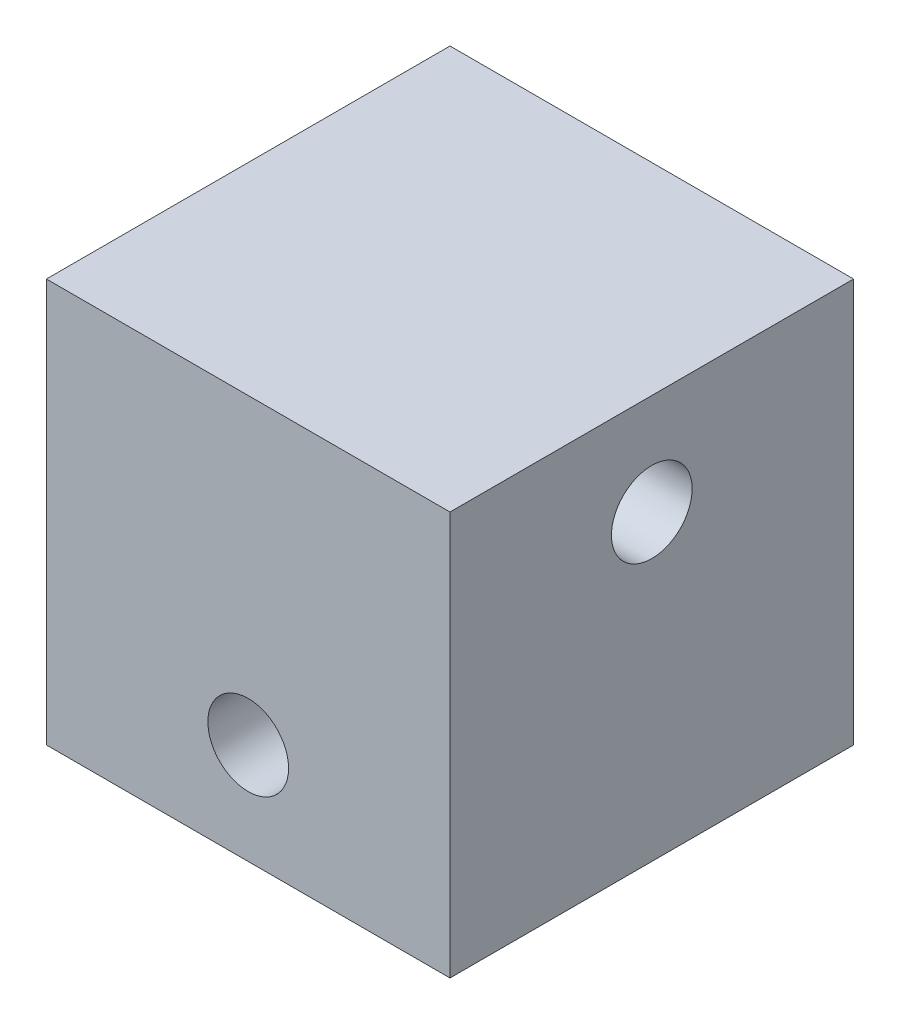
ISO-10303-21;
HEADER;
FILE_DESCRIPTION(('STEP AP214'),'2;1');
FILE_NAME('part.step','',(''),(''),'','','');
FILE_SCHEMA(('AUTOMOTIVE_DESIGN { 1 0 10303 214 1 1 1 1 }'));
ENDSEC;
DATA;
#1=APPLICATION_CONTEXT('core data for automotive mechanical design processes');
#2=APPLICATION_PROTOCOL_DEFINITION('international standard','automotive_design',2000,#1);
#3=PRODUCT_CONTEXT('',#1,'mechanical');
#4=PRODUCT('Part','Part','',(#3));
#5=PRODUCT_RELATED_PRODUCT_CATEGORY('part','',(#4));
#6=PRODUCT_DEFINITION_FORMATION('','',#4);
#7=PRODUCT_DEFINITION_CONTEXT('part definition',#1,'design');
#8=PRODUCT_DEFINITION('design','',#6,#7);
#9=PRODUCT_DEFINITION_SHAPE('','',#8);
#10=(LENGTH_UNIT() NAMED_UNIT(*) SI_UNIT(.MILLI.,.METRE.));
#11=(NAMED_UNIT(*) PLANE_ANGLE_UNIT() SI_UNIT($,.RADIAN.));
#12=(NAMED_UNIT(*) SI_UNIT($,.STERADIAN.) SOLID_ANGLE_UNIT());
#13=UNCERTAINTY_MEASURE_WITH_UNIT(LENGTH_MEASURE(1.E-05),#10,'distance_accuracy_value','');
#14=(GEOMETRIC_REPRESENTATION_CONTEXT(3) GLOBAL_UNCERTAINTY_ASSIGNED_CONTEXT((#13)) GLOBAL_UNIT_ASSIGNED_CONTEXT((#10,
#11,#12)) REPRESENTATION_CONTEXT('',''));
#15=CARTESIAN_POINT('',(0.,0.,0.));
#16=DIRECTION('',(0.,0.,1.));
#17=DIRECTION('',(1.,0.,0.));
#18=AXIS2_PLACEMENT_3D('',#15,#16,#17);
#19=CARTESIAN_POINT('',(-20.,0.,0.));
#20=DIRECTION('',(1.,0.,0.));
#21=DIRECTION('',(0.,0.,-1.));
#22=AXIS2_PLACEMENT_3D('',#19,#20,#21);
#23=CYLINDRICAL_SURFACE('',#22,4.);
#24=CARTESIAN_POINT('',(-20.,0.,0.));
#25=DIRECTION('',(1.,0.,0.));
#26=DIRECTION('',(0.,0.,-1.));
#27=AXIS2_PLACEMENT_3D('',#24,#25,#26);
#28=CIRCLE('',#27,4.);
#29=CARTESIAN_POINT('',(-20.,0.,-4.));
#30=VERTEX_POINT('',#29);
#31=EDGE_CURVE('E79',#30,#30,#28,.T.);
#32=ORIENTED_EDGE('',*,*,#31,.F.);
#33=EDGE_LOOP('',(#32));
#34=FACE_BOUND('',#33,.T.);
#35=CARTESIAN_POINT('',(20.,0.,0.));
#36=DIRECTION('',(1.,0.,0.));
#37=DIRECTION('',(0.,0.,-1.));
#38=AXIS2_PLACEMENT_3D('',#35,#36,#37);
#39=CIRCLE('',#38,4.);
#40=CARTESIAN_POINT('',(20.,0.,-4.));
#41=VERTEX_POINT('',#40);
#42=EDGE_CURVE('E21',#41,#41,#39,.F.);
#43=ORIENTED_EDGE('',*,*,#42,.F.);
#44=EDGE_LOOP('',(#43));
#45=FACE_BOUND('',#44,.T.);
#46=ADVANCED_FACE('F17',(#34,#45),#23,.F.);
#47=CARTESIAN_POINT('',(-20.01,-30.,20.01));
#48=DIRECTION('',(0.,-1.,0.));
#49=DIRECTION('',(0.,0.,-1.));
#50=AXIS2_PLACEMENT_3D('',#47,#48,#49);
#51=PLANE('',#50);
#52=DIRECTION('',(1.,0.,0.));
#53=VECTOR('',#52,1.);
#54=CARTESIAN_POINT('',(0.,-30.,20.));
#55=LINE('',#54,#53);
#56=CARTESIAN_POINT('',(-20.,-30.,20.));
#57=VERTEX_POINT('',#56);
#58=CARTESIAN_POINT('',(20.,-30.,20.));
#59=VERTEX_POINT('',#58);
#60=EDGE_CURVE('E100',#57,#59,#55,.T.);
#61=ORIENTED_EDGE('',*,*,#60,.F.);
#62=DIRECTION('',(0.,0.,1.));
#63=VECTOR('',#62,1.);
#64=CARTESIAN_POINT('',(-20.,-30.,0.));
#65=LINE('',#64,#63);
#66=CARTESIAN_POINT('',(-20.,-30.,-20.));
#67=VERTEX_POINT('',#66);
#68=EDGE_CURVE('E64',#67,#57,#65,.T.);
#69=ORIENTED_EDGE('',*,*,#68,.F.);
#70=DIRECTION('',(-1.,0.,0.));
#71=VECTOR('',#70,1.);
#72=CARTESIAN_POINT('',(0.,-30.,-20.));
#73=LINE('',#72,#71);
#74=CARTESIAN_POINT('',(20.,-30.,-20.));
#75=VERTEX_POINT('',#74);
#76=EDGE_CURVE('E73',#75,#67,#73,.T.);
#77=ORIENTED_EDGE('',*,*,#76,.F.);
#78=DIRECTION('',(0.,0.,-1.));
#79=VECTOR('',#78,1.);
#80=CARTESIAN_POINT('',(20.,-30.,0.));
#81=LINE('',#80,#79);
#82=EDGE_CURVE('E69',#59,#75,#81,.T.);
#83=ORIENTED_EDGE('',*,*,#82,.F.);
#84=EDGE_LOOP('',(#61,#69,#77,#83));
#85=FACE_BOUND('',#84,.T.);
#86=ADVANCED_FACE('F103',(#85),#51,.T.);
#87=CARTESIAN_POINT('',(20.,-30.01,20.01));
#88=DIRECTION('',(1.,0.,0.));
#89=DIRECTION('',(0.,0.,-1.));
#90=AXIS2_PLACEMENT_3D('',#87,#88,#89);
#91=PLANE('',#90);
#92=ORIENTED_EDGE('',*,*,#42,.T.);
#93=EDGE_LOOP('',(#92));
#94=FACE_BOUND('',#93,.T.);
#95=DIRECTION('',(0.,0.,-1.));
#96=VECTOR('',#95,1.);
#97=CARTESIAN_POINT('',(20.,10.,0.));
#98=LINE('',#97,#96);
#99=CARTESIAN_POINT('',(20.,10.,20.));
#100=VERTEX_POINT('',#99);
#101=CARTESIAN_POINT('',(20.,10.,-20.));
#102=VERTEX_POINT('',#101);
#103=EDGE_CURVE('E56',#100,#102,#98,.T.);
#104=ORIENTED_EDGE('',*,*,#103,.F.);
#105=DIRECTION('',(0.,1.,0.));
#106=VECTOR('',#105,1.);
#107=CARTESIAN_POINT('',(20.,-10.,20.));
#108=LINE('',#107,#106);
#109=EDGE_CURVE('E96',#59,#100,#108,.T.);
#110=ORIENTED_EDGE('',*,*,#109,.F.);
#111=ORIENTED_EDGE('',*,*,#82,.T.);
#112=DIRECTION('',(0.,-1.,0.));
#113=VECTOR('',#112,1.);
#114=CARTESIAN_POINT('',(20.,-10.,-20.));
#115=LINE('',#114,#113);
#116=EDGE_CURVE('E67',#102,#75,#115,.T.);
#117=ORIENTED_EDGE('',*,*,#116,.F.);
#118=EDGE_LOOP('',(#104,#110,#111,#117));
#119=FACE_BOUND('',#118,.T.);
#120=ADVANCED_FACE('F68',(#94,#119),#91,.T.);
#121=CARTESIAN_POINT('',(-20.01,10.,-20.01));
#122=DIRECTION('',(0.,1.,0.));
#123=DIRECTION('',(0.,0.,1.));
#124=AXIS2_PLACEMENT_3D('',#121,#122,#123);
#125=PLANE('',#124);
#126=DIRECTION('',(1.,0.,0.));
#127=VECTOR('',#126,1.);
#128=CARTESIAN_POINT('',(0.,9.99999999999999,-20.));
#129=LINE('',#128,#127);
#130=CARTESIAN_POINT('',(-20.,10.,-20.));
#131=VERTEX_POINT('',#130);
#132=EDGE_CURVE('E55',#131,#102,#129,.T.);
#133=ORIENTED_EDGE('',*,*,#132,.F.);
#134=DIRECTION('',(0.,0.,-1.));
#135=VECTOR('',#134,1.);
#136=CARTESIAN_POINT('',(-20.,9.99999999999999,0.));
#137=LINE('',#136,#135);
#138=CARTESIAN_POINT('',(-20.,10.,20.));
#139=VERTEX_POINT('',#138);
#140=EDGE_CURVE('E36',#139,#131,#137,.T.);
#141=ORIENTED_EDGE('',*,*,#140,.F.);
#142=DIRECTION('',(-1.,0.,0.));
#143=VECTOR('',#142,1.);
#144=CARTESIAN_POINT('',(0.,10.,20.));
#145=LINE('',#144,#143);
#146=EDGE_CURVE('E60',#100,#139,#145,.T.);
#147=ORIENTED_EDGE('',*,*,#146,.F.);
#148=ORIENTED_EDGE('',*,*,#103,.T.);
#149=EDGE_LOOP('',(#133,#141,#147,#148));
#150=FACE_BOUND('',#149,.T.);
#151=ADVANCED_FACE('F58',(#150),#125,.T.);
#152=CARTESIAN_POINT('',(-20.,-30.01,-20.01));
#153=DIRECTION('',(-1.,0.,0.));
#154=DIRECTION('',(0.,0.,1.));
#155=AXIS2_PLACEMENT_3D('',#152,#153,#154);
#156=PLANE('',#155);
#157=ORIENTED_EDGE('',*,*,#31,.T.);
#158=EDGE_LOOP('',(#157));
#159=FACE_BOUND('',#158,.T.);
#160=ORIENTED_EDGE('',*,*,#140,.T.);
#161=DIRECTION('',(0.,1.,0.));
#162=VECTOR('',#161,1.);
#163=CARTESIAN_POINT('',(-20.,-9.99999999999999,-20.));
#164=LINE('',#163,#162);
#165=EDGE_CURVE('E78',#67,#131,#164,.T.);
#166=ORIENTED_EDGE('',*,*,#165,.F.);
#167=ORIENTED_EDGE('',*,*,#68,.T.);
#168=DIRECTION('',(0.,-1.,0.));
#169=VECTOR('',#168,1.);
#170=CARTESIAN_POINT('',(-20.,-10.,20.));
#171=LINE('',#170,#169);
#172=EDGE_CURVE('E89',#139,#57,#171,.T.);
#173=ORIENTED_EDGE('',*,*,#172,.F.);
#174=EDGE_LOOP('',(#160,#166,#167,#173));
#175=FACE_BOUND('',#174,.T.);
#176=ADVANCED_FACE('F105',(#159,#175),#156,.T.);
#177=CARTESIAN_POINT('',(-20.01,-30.01,-20.));
#178=DIRECTION('',(0.,0.,-1.));
#179=DIRECTION('',(0.,1.,0.));
#180=AXIS2_PLACEMENT_3D('',#177,#178,#179);
#181=PLANE('',#180);
#182=CARTESIAN_POINT('',(0.,-20.,-20.));
#183=DIRECTION('',(0.,0.,1.));
#184=DIRECTION('',(1.,0.,0.));
#185=AXIS2_PLACEMENT_3D('',#182,#183,#184);
#186=CIRCLE('',#185,4.);
#187=CARTESIAN_POINT('',(4.,-20.,-20.));
#188=VERTEX_POINT('',#187);
#189=EDGE_CURVE('E27',#188,#188,#186,.F.);
#190=ORIENTED_EDGE('',*,*,#189,.F.);
#191=EDGE_LOOP('',(#190));
#192=FACE_BOUND('',#191,.T.);
#193=ORIENTED_EDGE('',*,*,#76,.T.);
#194=ORIENTED_EDGE('',*,*,#165,.T.);
#195=ORIENTED_EDGE('',*,*,#132,.T.);
#196=ORIENTED_EDGE('',*,*,#116,.T.);
#197=EDGE_LOOP('',(#193,#194,#195,#196));
#198=FACE_BOUND('',#197,.T.);
#199=ADVANCED_FACE('F76',(#192,#198),#181,.T.);
#200=CARTESIAN_POINT('',(-20.01,10.01,20.));
#201=DIRECTION('',(0.,0.,1.));
#202=DIRECTION('',(0.,-1.,0.));
#203=AXIS2_PLACEMENT_3D('',#200,#201,#202);
#204=PLANE('',#203);
#205=CARTESIAN_POINT('',(0.,-20.,20.));
#206=DIRECTION('',(0.,0.,1.));
#207=DIRECTION('',(1.,0.,0.));
#208=AXIS2_PLACEMENT_3D('',#205,#206,#207);
#209=CIRCLE('',#208,4.);
#210=CARTESIAN_POINT('',(4.,-20.,20.));
#211=VERTEX_POINT('',#210);
#212=EDGE_CURVE('E11',#211,#211,#209,.T.);
#213=ORIENTED_EDGE('',*,*,#212,.F.);
#214=EDGE_LOOP('',(#213));
#215=FACE_BOUND('',#214,.T.);
#216=ORIENTED_EDGE('',*,*,#146,.T.);
#217=ORIENTED_EDGE('',*,*,#172,.T.);
#218=ORIENTED_EDGE('',*,*,#60,.T.);
#219=ORIENTED_EDGE('',*,*,#109,.T.);
#220=EDGE_LOOP('',(#216,#217,#218,#219));
#221=FACE_BOUND('',#220,.T.);
#222=ADVANCED_FACE('F106',(#215,#221),#204,.T.);
#223=CARTESIAN_POINT('',(0.,-20.,-20.));
#224=DIRECTION('',(0.,0.,1.));
#225=DIRECTION('',(1.,0.,0.));
#226=AXIS2_PLACEMENT_3D('',#223,#224,#225);
#227=CYLINDRICAL_SURFACE('',#226,4.);
#228=ORIENTED_EDGE('',*,*,#212,.T.);
#229=EDGE_LOOP('',(#228));
#230=FACE_BOUND('',#229,.T.);
#231=ORIENTED_EDGE('',*,*,#189,.T.);
#232=EDGE_LOOP('',(#231));
#233=FACE_BOUND('',#232,.T.);
#234=ADVANCED_FACE('F19',(#230,#233),#227,.F.);
#235=CLOSED_SHELL('',(#46,#86,#120,#151,#176,#199,#222,#234));
#236=MANIFOLD_SOLID_BREP('B1',#235);
#237=ADVANCED_BREP_SHAPE_REPRESENTATION('',(#18,#236),#14);
#238=SHAPE_DEFINITION_REPRESENTATION(#9,#237);
ENDSEC;
END-ISO-10303-21;
